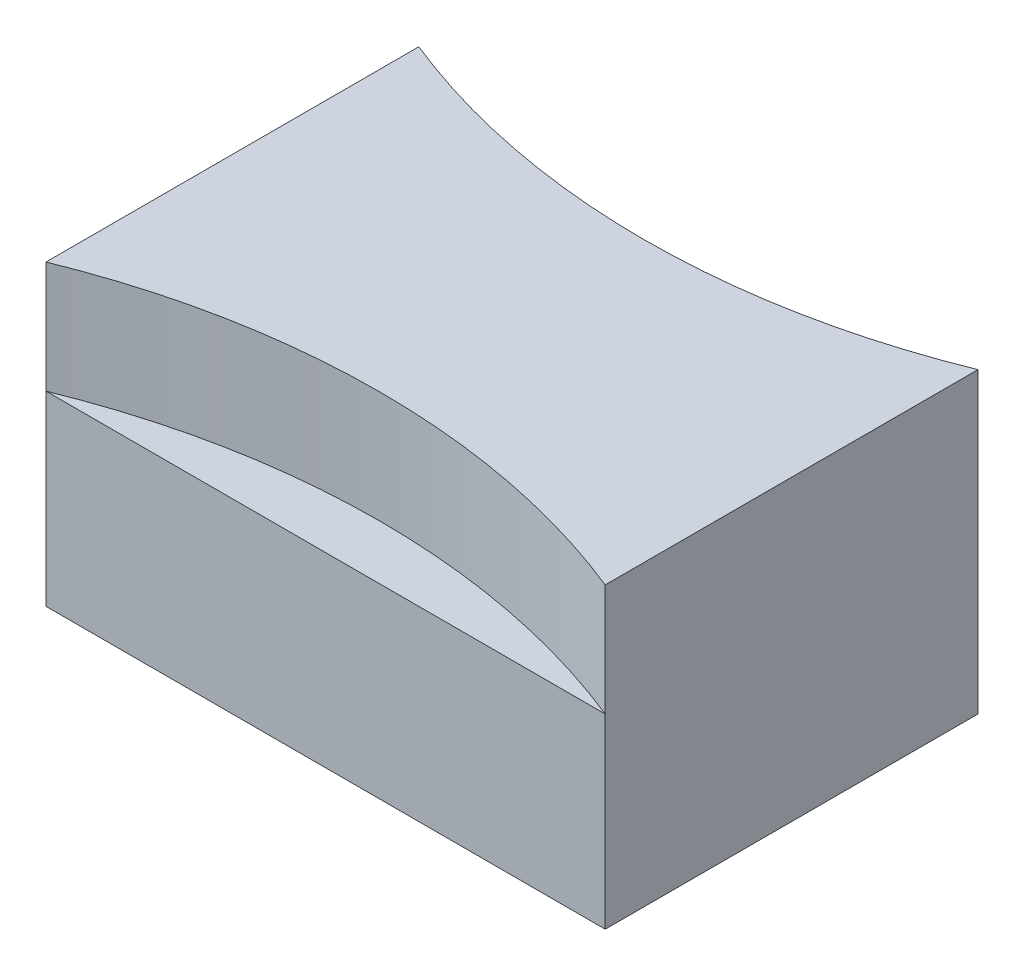
ISO-10303-21;
HEADER;
FILE_DESCRIPTION(('STEP AP214'),'2;1');
FILE_NAME('part.step','',(''),(''),'','','');
FILE_SCHEMA(('AUTOMOTIVE_DESIGN { 1 0 10303 214 1 1 1 1 }'));
ENDSEC;
DATA;
#1=APPLICATION_CONTEXT('core data for automotive mechanical design processes');
#2=APPLICATION_PROTOCOL_DEFINITION('international standard','automotive_design',2000,#1);
#3=PRODUCT_CONTEXT('',#1,'mechanical');
#4=PRODUCT('Part','Part','',(#3));
#5=PRODUCT_RELATED_PRODUCT_CATEGORY('part','',(#4));
#6=PRODUCT_DEFINITION_FORMATION('','',#4);
#7=PRODUCT_DEFINITION_CONTEXT('part definition',#1,'design');
#8=PRODUCT_DEFINITION('design','',#6,#7);
#9=PRODUCT_DEFINITION_SHAPE('','',#8);
#10=(LENGTH_UNIT() NAMED_UNIT(*) SI_UNIT(.MILLI.,.METRE.));
#11=(NAMED_UNIT(*) PLANE_ANGLE_UNIT() SI_UNIT($,.RADIAN.));
#12=(NAMED_UNIT(*) SI_UNIT($,.STERADIAN.) SOLID_ANGLE_UNIT());
#13=UNCERTAINTY_MEASURE_WITH_UNIT(LENGTH_MEASURE(1.E-05),#10,'distance_accuracy_value','');
#14=(GEOMETRIC_REPRESENTATION_CONTEXT(3) GLOBAL_UNCERTAINTY_ASSIGNED_CONTEXT((#13)) GLOBAL_UNIT_ASSIGNED_CONTEXT((#10,
#11,#12)) REPRESENTATION_CONTEXT('',''));
#15=CARTESIAN_POINT('',(0.,0.,0.));
#16=DIRECTION('',(0.,0.,1.));
#17=DIRECTION('',(1.,0.,0.));
#18=AXIS2_PLACEMENT_3D('',#15,#16,#17);
#19=CARTESIAN_POINT('',(-7.5,8.,5.));
#20=DIRECTION('',(0.,0.,-1.));
#21=DIRECTION('',(-1.,0.,0.));
#22=AXIS2_PLACEMENT_3D('',#19,#20,#21);
#23=PLANE('',#22);
#24=DIRECTION('',(1.,0.,0.));
#25=VECTOR('',#24,1.);
#26=CARTESIAN_POINT('',(-14.1637250186175,5.,5.));
#27=LINE('',#26,#25);
#28=CARTESIAN_POINT('',(-7.5,5.,5.));
#29=VERTEX_POINT('',#28);
#30=CARTESIAN_POINT('',(7.5,5.,5.));
#31=VERTEX_POINT('',#30);
#32=EDGE_CURVE('E143',#29,#31,#27,.T.);
#33=ORIENTED_EDGE('',*,*,#32,.F.);
#34=DIRECTION('',(0.,-1.,0.));
#35=VECTOR('',#34,1.);
#36=CARTESIAN_POINT('',(-7.5,8.,5.));
#37=LINE('',#36,#35);
#38=CARTESIAN_POINT('',(-7.5,0.,5.));
#39=VERTEX_POINT('',#38);
#40=EDGE_CURVE('E68',#29,#39,#37,.T.);
#41=ORIENTED_EDGE('',*,*,#40,.T.);
#42=DIRECTION('',(1.,0.,0.));
#43=VECTOR('',#42,1.);
#44=CARTESIAN_POINT('',(-7.5,0.,5.));
#45=LINE('',#44,#43);
#46=CARTESIAN_POINT('',(7.5,0.,5.));
#47=VERTEX_POINT('',#46);
#48=EDGE_CURVE('E83',#39,#47,#45,.T.);
#49=ORIENTED_EDGE('',*,*,#48,.T.);
#50=DIRECTION('',(0.,-1.,0.));
#51=VECTOR('',#50,1.);
#52=CARTESIAN_POINT('',(7.5,8.,5.));
#53=LINE('',#52,#51);
#54=EDGE_CURVE('E74',#31,#47,#53,.T.);
#55=ORIENTED_EDGE('',*,*,#54,.F.);
#56=EDGE_LOOP('',(#33,#41,#49,#55));
#57=FACE_BOUND('',#56,.T.);
#58=ADVANCED_FACE('F33',(#57),#23,.F.);
#59=CARTESIAN_POINT('',(7.5,8.,-5.));
#60=DIRECTION('',(0.,-1.,0.));
#61=DIRECTION('',(0.,0.,-1.));
#62=AXIS2_PLACEMENT_3D('',#59,#60,#61);
#63=PLANE('',#62);
#64=CARTESIAN_POINT('',(0.,8.,23.5404962177392));
#65=DIRECTION('',(0.,1.,0.));
#66=DIRECTION('',(0.,0.,1.));
#67=AXIS2_PLACEMENT_3D('',#64,#65,#66);
#68=CIRCLE('',#67,20.);
#69=CARTESIAN_POINT('',(-7.5,8.,5.));
#70=VERTEX_POINT('',#69);
#71=CARTESIAN_POINT('',(7.5,8.,5.));
#72=VERTEX_POINT('',#71);
#73=EDGE_CURVE('E135',#70,#72,#68,.F.);
#74=ORIENTED_EDGE('',*,*,#73,.T.);
#75=DIRECTION('',(0.,0.,-1.));
#76=VECTOR('',#75,1.);
#77=CARTESIAN_POINT('',(7.5,8.,5.));
#78=LINE('',#77,#76);
#79=CARTESIAN_POINT('',(7.5,8.,-5.));
#80=VERTEX_POINT('',#79);
#81=EDGE_CURVE('E86',#72,#80,#78,.T.);
#82=ORIENTED_EDGE('',*,*,#81,.T.);
#83=CARTESIAN_POINT('',(0.,8.,-23.5404962177392));
#84=DIRECTION('',(0.,1.,0.));
#85=DIRECTION('',(0.,0.,1.));
#86=AXIS2_PLACEMENT_3D('',#83,#84,#85);
#87=CIRCLE('',#86,20.);
#88=CARTESIAN_POINT('',(-7.5,8.,-5.));
#89=VERTEX_POINT('',#88);
#90=EDGE_CURVE('E126',#89,#80,#87,.T.);
#91=ORIENTED_EDGE('',*,*,#90,.F.);
#92=DIRECTION('',(0.,0.,1.));
#93=VECTOR('',#92,1.);
#94=CARTESIAN_POINT('',(-7.5,8.,5.));
#95=LINE('',#94,#93);
#96=EDGE_CURVE('E80',#89,#70,#95,.T.);
#97=ORIENTED_EDGE('',*,*,#96,.T.);
#98=EDGE_LOOP('',(#74,#82,#91,#97));
#99=FACE_BOUND('',#98,.T.);
#100=ADVANCED_FACE('F141',(#99),#63,.F.);
#101=CARTESIAN_POINT('',(-7.5,8.,-5.));
#102=DIRECTION('',(0.,0.,1.));
#103=DIRECTION('',(1.,0.,0.));
#104=AXIS2_PLACEMENT_3D('',#101,#102,#103);
#105=PLANE('',#104);
#106=DIRECTION('',(-1.,0.,0.));
#107=VECTOR('',#106,1.);
#108=CARTESIAN_POINT('',(-14.1637250186175,5.,-5.));
#109=LINE('',#108,#107);
#110=CARTESIAN_POINT('',(7.5,5.,-5.));
#111=VERTEX_POINT('',#110);
#112=CARTESIAN_POINT('',(-7.5,5.,-5.));
#113=VERTEX_POINT('',#112);
#114=EDGE_CURVE('E97',#111,#113,#109,.T.);
#115=ORIENTED_EDGE('',*,*,#114,.F.);
#116=DIRECTION('',(0.,-1.,0.));
#117=VECTOR('',#116,1.);
#118=CARTESIAN_POINT('',(7.5,8.,-5.));
#119=LINE('',#118,#117);
#120=CARTESIAN_POINT('',(7.5,0.,-5.));
#121=VERTEX_POINT('',#120);
#122=EDGE_CURVE('E42',#111,#121,#119,.T.);
#123=ORIENTED_EDGE('',*,*,#122,.T.);
#124=DIRECTION('',(-1.,0.,0.));
#125=VECTOR('',#124,1.);
#126=CARTESIAN_POINT('',(-7.5,0.,-5.));
#127=LINE('',#126,#125);
#128=CARTESIAN_POINT('',(-7.5,0.,-5.));
#129=VERTEX_POINT('',#128);
#130=EDGE_CURVE('E92',#121,#129,#127,.T.);
#131=ORIENTED_EDGE('',*,*,#130,.T.);
#132=DIRECTION('',(0.,-1.,0.));
#133=VECTOR('',#132,1.);
#134=CARTESIAN_POINT('',(-7.5,8.,-5.));
#135=LINE('',#134,#133);
#136=EDGE_CURVE('E105',#113,#129,#135,.T.);
#137=ORIENTED_EDGE('',*,*,#136,.F.);
#138=EDGE_LOOP('',(#115,#123,#131,#137));
#139=FACE_BOUND('',#138,.T.);
#140=ADVANCED_FACE('F115',(#139),#105,.F.);
#141=CARTESIAN_POINT('',(7.5,8.,5.));
#142=DIRECTION('',(-1.,0.,0.));
#143=DIRECTION('',(0.,0.,1.));
#144=AXIS2_PLACEMENT_3D('',#141,#142,#143);
#145=PLANE('',#144);
#146=DIRECTION('',(0.,0.,-1.));
#147=VECTOR('',#146,1.);
#148=CARTESIAN_POINT('',(7.5,0.,5.));
#149=LINE('',#148,#147);
#150=EDGE_CURVE('E77',#47,#121,#149,.T.);
#151=ORIENTED_EDGE('',*,*,#150,.T.);
#152=ORIENTED_EDGE('',*,*,#122,.F.);
#153=EDGE_CURVE('E11',#80,#111,#119,.T.);
#154=ORIENTED_EDGE('',*,*,#153,.F.);
#155=ORIENTED_EDGE('',*,*,#81,.F.);
#156=EDGE_CURVE('E50',#72,#31,#53,.T.);
#157=ORIENTED_EDGE('',*,*,#156,.T.);
#158=ORIENTED_EDGE('',*,*,#54,.T.);
#159=EDGE_LOOP('',(#151,#152,#154,#155,#157,#158));
#160=FACE_BOUND('',#159,.T.);
#161=ADVANCED_FACE('F35',(#160),#145,.F.);
#162=CARTESIAN_POINT('',(-7.5,8.,5.));
#163=DIRECTION('',(1.,0.,0.));
#164=DIRECTION('',(0.,0.,-1.));
#165=AXIS2_PLACEMENT_3D('',#162,#163,#164);
#166=PLANE('',#165);
#167=DIRECTION('',(0.,0.,1.));
#168=VECTOR('',#167,1.);
#169=CARTESIAN_POINT('',(-7.5,0.,5.));
#170=LINE('',#169,#168);
#171=EDGE_CURVE('E87',#129,#39,#170,.T.);
#172=ORIENTED_EDGE('',*,*,#171,.T.);
#173=ORIENTED_EDGE('',*,*,#40,.F.);
#174=EDGE_CURVE('E103',#70,#29,#37,.T.);
#175=ORIENTED_EDGE('',*,*,#174,.F.);
#176=ORIENTED_EDGE('',*,*,#96,.F.);
#177=EDGE_CURVE('E106',#89,#113,#135,.T.);
#178=ORIENTED_EDGE('',*,*,#177,.T.);
#179=ORIENTED_EDGE('',*,*,#136,.T.);
#180=EDGE_LOOP('',(#172,#173,#175,#176,#178,#179));
#181=FACE_BOUND('',#180,.T.);
#182=ADVANCED_FACE('F112',(#181),#166,.F.);
#183=CARTESIAN_POINT('',(7.5,0.,-5.));
#184=DIRECTION('',(0.,-1.,0.));
#185=DIRECTION('',(0.,0.,-1.));
#186=AXIS2_PLACEMENT_3D('',#183,#184,#185);
#187=PLANE('',#186);
#188=ORIENTED_EDGE('',*,*,#150,.F.);
#189=ORIENTED_EDGE('',*,*,#48,.F.);
#190=ORIENTED_EDGE('',*,*,#171,.F.);
#191=ORIENTED_EDGE('',*,*,#130,.F.);
#192=EDGE_LOOP('',(#188,#189,#190,#191));
#193=FACE_BOUND('',#192,.T.);
#194=ADVANCED_FACE('F90',(#193),#187,.T.);
#195=CARTESIAN_POINT('',(0.,5.,-23.5404962177392));
#196=DIRECTION('',(0.,1.,0.));
#197=DIRECTION('',(0.,0.,1.));
#198=AXIS2_PLACEMENT_3D('',#195,#196,#197);
#199=CYLINDRICAL_SURFACE('',#198,20.);
#200=ORIENTED_EDGE('',*,*,#90,.T.);
#201=ORIENTED_EDGE('',*,*,#153,.T.);
#202=CARTESIAN_POINT('',(0.,5.,-23.5404962177392));
#203=DIRECTION('',(0.,1.,0.));
#204=DIRECTION('',(0.,0.,1.));
#205=AXIS2_PLACEMENT_3D('',#202,#203,#204);
#206=CIRCLE('',#205,20.);
#207=EDGE_CURVE('E93',#113,#111,#206,.T.);
#208=ORIENTED_EDGE('',*,*,#207,.F.);
#209=ORIENTED_EDGE('',*,*,#177,.F.);
#210=EDGE_LOOP('',(#200,#201,#208,#209));
#211=FACE_BOUND('',#210,.T.);
#212=ADVANCED_FACE('F182',(#211),#199,.F.);
#213=CARTESIAN_POINT('',(-14.1637250186175,5.,0.));
#214=DIRECTION('',(0.,1.,0.));
#215=DIRECTION('',(0.,0.,1.));
#216=AXIS2_PLACEMENT_3D('',#213,#214,#215);
#217=PLANE('',#216);
#218=ORIENTED_EDGE('',*,*,#114,.T.);
#219=ORIENTED_EDGE('',*,*,#207,.T.);
#220=EDGE_LOOP('',(#218,#219));
#221=FACE_BOUND('',#220,.T.);
#222=ADVANCED_FACE('F154',(#221),#217,.T.);
#223=CARTESIAN_POINT('',(0.,5.,23.5404962177392));
#224=DIRECTION('',(0.,1.,0.));
#225=DIRECTION('',(0.,0.,1.));
#226=AXIS2_PLACEMENT_3D('',#223,#224,#225);
#227=CYLINDRICAL_SURFACE('',#226,20.);
#228=ORIENTED_EDGE('',*,*,#73,.F.);
#229=ORIENTED_EDGE('',*,*,#174,.T.);
#230=CARTESIAN_POINT('',(0.,5.,23.5404962177392));
#231=DIRECTION('',(0.,1.,0.));
#232=DIRECTION('',(0.,0.,1.));
#233=AXIS2_PLACEMENT_3D('',#230,#231,#232);
#234=CIRCLE('',#233,20.);
#235=EDGE_CURVE('E131',#29,#31,#234,.F.);
#236=ORIENTED_EDGE('',*,*,#235,.T.);
#237=ORIENTED_EDGE('',*,*,#156,.F.);
#238=EDGE_LOOP('',(#228,#229,#236,#237));
#239=FACE_BOUND('',#238,.T.);
#240=ADVANCED_FACE('F137',(#239),#227,.F.);
#241=CARTESIAN_POINT('',(-14.1637250186175,5.,0.));
#242=DIRECTION('',(0.,1.,0.));
#243=DIRECTION('',(0.,0.,1.));
#244=AXIS2_PLACEMENT_3D('',#241,#242,#243);
#245=PLANE('',#244);
#246=ORIENTED_EDGE('',*,*,#235,.F.);
#247=ORIENTED_EDGE('',*,*,#32,.T.);
#248=EDGE_LOOP('',(#246,#247));
#249=FACE_BOUND('',#248,.T.);
#250=ADVANCED_FACE('F148',(#249),#245,.T.);
#251=CLOSED_SHELL('',(#58,#100,#140,#161,#182,#194,#212,#222,#240,#250));
#252=MANIFOLD_SOLID_BREP('B2',#251);
#253=ADVANCED_BREP_SHAPE_REPRESENTATION('',(#18,#252),#14);
#254=SHAPE_DEFINITION_REPRESENTATION(#9,#253);
ENDSEC;
END-ISO-10303-21;
